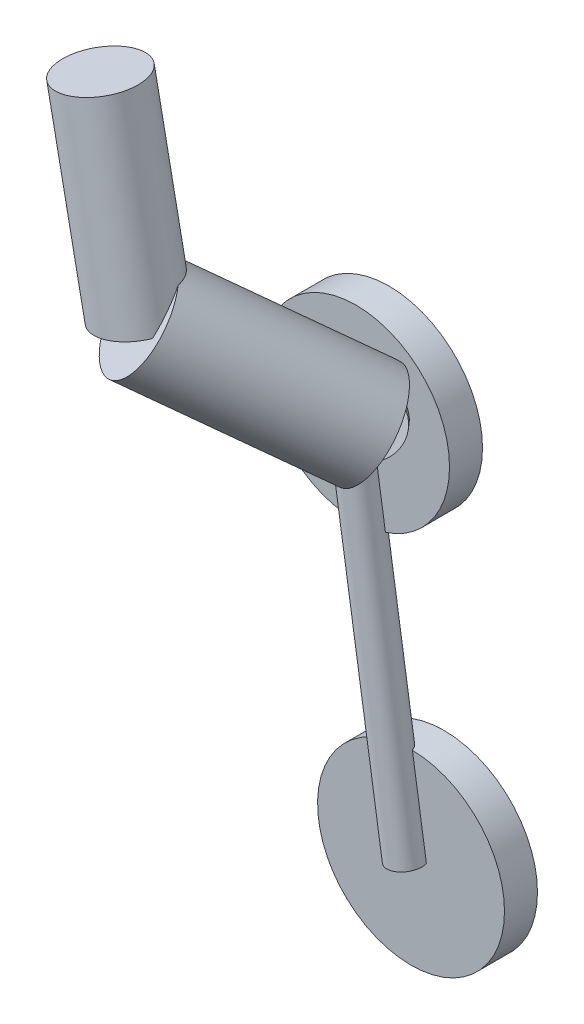
ISO-10303-21;
HEADER;
FILE_DESCRIPTION(('STEP AP214'),'2;1');
FILE_NAME('part.step','',(''),(''),'','','');
FILE_SCHEMA(('AUTOMOTIVE_DESIGN { 1 0 10303 214 1 1 1 1 }'));
ENDSEC;
DATA;
#1=APPLICATION_CONTEXT('core data for automotive mechanical design processes');
#2=APPLICATION_PROTOCOL_DEFINITION('international standard','automotive_design',2000,#1);
#3=PRODUCT_CONTEXT('',#1,'mechanical');
#4=PRODUCT('Part','Part','',(#3));
#5=PRODUCT_RELATED_PRODUCT_CATEGORY('part','',(#4));
#6=PRODUCT_DEFINITION_FORMATION('','',#4);
#7=PRODUCT_DEFINITION_CONTEXT('part definition',#1,'design');
#8=PRODUCT_DEFINITION('design','',#6,#7);
#9=PRODUCT_DEFINITION_SHAPE('','',#8);
#10=(LENGTH_UNIT() NAMED_UNIT(*) SI_UNIT(.MILLI.,.METRE.));
#11=(NAMED_UNIT(*) PLANE_ANGLE_UNIT() SI_UNIT($,.RADIAN.));
#12=(NAMED_UNIT(*) SI_UNIT($,.STERADIAN.) SOLID_ANGLE_UNIT());
#13=UNCERTAINTY_MEASURE_WITH_UNIT(LENGTH_MEASURE(1.E-05),#10,'distance_accuracy_value','');
#14=(GEOMETRIC_REPRESENTATION_CONTEXT(3) GLOBAL_UNCERTAINTY_ASSIGNED_CONTEXT((#13)) GLOBAL_UNIT_ASSIGNED_CONTEXT((#10,
#11,#12)) REPRESENTATION_CONTEXT('',''));
#15=CARTESIAN_POINT('',(0.,0.,0.));
#16=DIRECTION('',(0.,0.,1.));
#17=DIRECTION('',(1.,0.,0.));
#18=AXIS2_PLACEMENT_3D('',#15,#16,#17);
#19=CARTESIAN_POINT('',(-418.1,30.0000000000001,76.));
#20=DIRECTION('',(0.196116135138186,-0.98058067569092,0.));
#21=DIRECTION('',(0.98058067569092,0.196116135138186,0.));
#22=AXIS2_PLACEMENT_3D('',#19,#20,#21);
#23=PLANE('',#22);
#24=CARTESIAN_POINT('',(-418.1,30.0000000000001,76.));
#25=DIRECTION('',(0.196116135138186,-0.98058067569092,0.));
#26=DIRECTION('',(0.98058067569092,0.196116135138186,0.));
#27=AXIS2_PLACEMENT_3D('',#24,#25,#26);
#28=CIRCLE('',#27,6.99999999999998);
#29=CARTESIAN_POINT('',(-412.141803911932,31.1916392176136,79.4756143847064));
#30=VERTEX_POINT('',#29);
#31=CARTESIAN_POINT('',(-424.058196088068,28.8083607823865,72.5243856152937));
#32=VERTEX_POINT('',#31);
#33=EDGE_CURVE('E229',#30,#32,#28,.T.);
#34=ORIENTED_EDGE('',*,*,#33,.T.);
#35=DIRECTION('',(0.851170869723985,0.170234173944798,0.496516340672336));
#36=VECTOR('',#35,1.);
#37=CARTESIAN_POINT('',(-418.1,30.0000000000001,76.));
#38=LINE('',#37,#36);
#39=EDGE_CURVE('E224',#32,#30,#38,.T.);
#40=ORIENTED_EDGE('',*,*,#39,.T.);
#41=EDGE_LOOP('',(#34,#40));
#42=FACE_BOUND('',#41,.T.);
#43=ADVANCED_FACE('F73',(#42),#23,.T.);
#44=CARTESIAN_POINT('',(-425.1,65.0000000000001,76.));
#45=DIRECTION('',(0.196116135138184,-0.98058067569092,0.));
#46=DIRECTION('',(0.98058067569092,0.196116135138184,0.));
#47=AXIS2_PLACEMENT_3D('',#44,#45,#46);
#48=CYLINDRICAL_SURFACE('',#47,6.99999999999998);
#49=CARTESIAN_POINT('',(-425.1,65.0000000000001,76.));
#50=DIRECTION('',(0.196116135138186,-0.98058067569092,0.));
#51=DIRECTION('',(0.98058067569092,0.196116135138186,0.));
#52=AXIS2_PLACEMENT_3D('',#49,#50,#51);
#53=CIRCLE('',#52,6.99999999999998);
#54=CARTESIAN_POINT('',(-418.235935270164,66.3728129459674,76.));
#55=VERTEX_POINT('',#54);
#56=EDGE_CURVE('E226',#55,#55,#53,.T.);
#57=ORIENTED_EDGE('',*,*,#56,.T.);
#58=EDGE_LOOP('',(#57));
#59=FACE_BOUND('',#58,.T.);
#60=ORIENTED_EDGE('',*,*,#33,.F.);
#61=CARTESIAN_POINT('',(-418.1,30.0000000000001,76.));
#62=DIRECTION('',(0.499230176602714,-0.554700196225227,-0.665640235470272));
#63=DIRECTION('',(-0.162102995970275,-0.814449518588493,0.557130685179369));
#64=AXIS2_PLACEMENT_3D('',#61,#62,#63);
#65=ELLIPSE('',#64,10.9062232352501,6.99999999999998);
#66=CARTESIAN_POINT('',(-412.515701600669,36.8857417206084,74.4501056989915));
#67=VERTEX_POINT('',#66);
#68=EDGE_CURVE('E264',#30,#67,#65,.F.);
#69=ORIENTED_EDGE('',*,*,#68,.T.);
#70=CARTESIAN_POINT('',(-421.292691032873,35.1303438341679,69.3301951968721));
#71=CARTESIAN_POINT('',(-421.201196665406,35.1486458103378,69.3004736513031));
#72=CARTESIAN_POINT('',(-421.109263316592,35.1678563071932,69.2727157483057));
#73=CARTESIAN_POINT('',(-420.924630088828,35.2078119264483,69.2211700708622));
#74=CARTESIAN_POINT('',(-420.83193028739,35.2285568953108,69.1973818999837));
#75=CARTESIAN_POINT('',(-420.552920744037,35.2926527992798,69.1320513257817));
#76=CARTESIAN_POINT('',(-420.365602314339,35.3378850043576,69.0965108354709));
#77=CARTESIAN_POINT('',(-419.989501799221,35.4313290540945,69.0417074082911));
#78=CARTESIAN_POINT('',(-419.800720729853,35.4795389686479,69.0224340437146));
#79=CARTESIAN_POINT('',(-419.422529125842,35.5773072190837,69.0002199353194));
#80=CARTESIAN_POINT('',(-419.233118548431,35.6268656483016,68.9972803249208));
#81=CARTESIAN_POINT('',(-418.85482001879,35.7258908863014,69.0077477930543));
#82=CARTESIAN_POINT('',(-418.66593186774,35.7753577265426,69.0211474232981));
#83=CARTESIAN_POINT('',(-418.289688656918,35.8730347151101,69.0641971341939));
#84=CARTESIAN_POINT('',(-418.102333580539,35.9212448770614,69.0938470385839));
#85=CARTESIAN_POINT('',(-417.730349197048,36.0154060142361,69.1692039897324));
#86=CARTESIAN_POINT('',(-417.545719275849,36.0613575040411,69.2149073596023));
#87=CARTESIAN_POINT('',(-417.180335923696,36.1502008522402,69.322075803387));
#88=CARTESIAN_POINT('',(-416.999582498921,36.1930927057571,69.3835409024255));
#89=CARTESIAN_POINT('',(-416.642356795563,36.2753630005016,69.5221339870124));
#90=CARTESIAN_POINT('',(-416.465907950407,36.3147244280699,69.5993325062869));
#91=CARTESIAN_POINT('',(-416.119402838848,36.3892305731797,69.7686696854893));
#92=CARTESIAN_POINT('',(-415.949346607104,36.4243752678619,69.8608084264034));
#93=CARTESIAN_POINT('',(-415.616856513873,36.4901388662376,70.0593591532529));
#94=CARTESIAN_POINT('',(-415.454422856132,36.5207576490035,70.1657715204198));
#95=CARTESIAN_POINT('',(-415.138382979101,36.5773325248755,70.3920846752108));
#96=CARTESIAN_POINT('',(-414.984776665361,36.6032886678762,70.5119853184756));
#97=CARTESIAN_POINT('',(-414.689385686944,36.6502885913913,70.7628250942869));
#98=CARTESIAN_POINT('',(-414.547477890069,36.6713893806518,70.8936086297245));
#99=CARTESIAN_POINT('',(-414.274435583674,36.7093068583583,71.1665461422087));
#100=CARTESIAN_POINT('',(-414.143301069295,36.7261235487362,71.3087001141274));
#101=CARTESIAN_POINT('',(-413.892780253326,36.7558788814993,71.6034028376731));
#102=CARTESIAN_POINT('',(-413.773394878038,36.7688172182787,71.7559524072889));
#103=CARTESIAN_POINT('',(-413.547308343999,36.7914167002375,72.0704059485969));
#104=CARTESIAN_POINT('',(-413.440607075665,36.8010778737302,72.2323098394572));
#105=CARTESIAN_POINT('',(-413.245306975505,36.8175572174245,72.5568533570085));
#106=CARTESIAN_POINT('',(-413.156106029234,36.8244845916663,72.719125518639));
#107=CARTESIAN_POINT('',(-412.990798242488,36.8370166202709,73.0502391056136));
#108=CARTESIAN_POINT('',(-412.914689999754,36.8426214163088,73.219079825072));
#109=CARTESIAN_POINT('',(-412.77624945429,36.8536317742233,73.5624018581627));
#110=CARTESIAN_POINT('',(-412.713921804602,36.8590372682935,73.7368850542617));
#111=CARTESIAN_POINT('',(-412.603756430106,36.8710937335624,74.09038620134));
#112=CARTESIAN_POINT('',(-412.555923799548,36.8777451413094,74.2694057227061));
#113=CARTESIAN_POINT('',(-412.515701600669,36.8857417206084,74.4501056989913));
#114=B_SPLINE_CURVE_WITH_KNOTS('',3,(#70,#71,#72,#73,#74,#75,#76,#77,#78,#79,#80,#81,#82,#83,
#84,#85,#86,#87,#88,#89,#90,#91,#92,#93,#94,#95,#96,#97,#98,#99,#100,#101,#102,#103,#104,#105,
#106,#107,#108,#109,#110,#111,#112,#113),.UNSPECIFIED.,.F.,.F.,(4,2,2,2,2,2,2,2,2,2,2,2,2,2,2,2,
2,2,2,2,2,4),(0.,0.293724164008241,0.587418978041268,1.17449294195843,1.76119028770752,
2.34792834463022,2.93439903533553,3.52086336488549,4.10719345803307,4.69352448577125,
5.28254428878717,5.87156728479613,6.46060601603824,7.04963844364955,7.63135493594895,
8.21307116590418,8.79483322179158,9.37659025134636,9.93192221789129,10.4871946700164,
11.042654325483,11.598308970498),.UNSPECIFIED.);
#115=CARTESIAN_POINT('',(-421.292691032873,35.1303438341679,69.3301951968721));
#116=VERTEX_POINT('',#115);
#117=EDGE_CURVE('E232',#116,#67,#114,.T.);
#118=ORIENTED_EDGE('',*,*,#117,.F.);
#119=EDGE_CURVE('E241',#116,#32,#65,.F.);
#120=ORIENTED_EDGE('',*,*,#119,.T.);
#121=EDGE_LOOP('',(#60,#69,#118,#120));
#122=FACE_BOUND('',#121,.T.);
#123=ADVANCED_FACE('F243',(#59,#122),#48,.T.);
#124=CARTESIAN_POINT('',(-425.1,65.0000000000001,76.));
#125=DIRECTION('',(0.196116135138186,-0.98058067569092,0.));
#126=DIRECTION('',(0.98058067569092,0.196116135138186,0.));
#127=AXIS2_PLACEMENT_3D('',#124,#125,#126);
#128=PLANE('',#127);
#129=ORIENTED_EDGE('',*,*,#56,.F.);
#130=EDGE_LOOP('',(#129));
#131=FACE_BOUND('',#130,.T.);
#132=ADVANCED_FACE('F75',(#131),#128,.F.);
#133=CARTESIAN_POINT('',(-418.1,30.,76.));
#134=DIRECTION('',(0.499230176602714,-0.554700196225227,-0.665640235470272));
#135=DIRECTION('',(0.,0.768221279597376,-0.64018439966448));
#136=AXIS2_PLACEMENT_3D('',#133,#134,#135);
#137=PLANE('',#136);
#138=ORIENTED_EDGE('',*,*,#68,.F.);
#139=ORIENTED_EDGE('',*,*,#39,.F.);
#140=ORIENTED_EDGE('',*,*,#119,.F.);
#141=CARTESIAN_POINT('',(-418.1,30.,76.));
#142=DIRECTION('',(0.499230176602714,-0.554700196225227,-0.665640235470272));
#143=DIRECTION('',(0.,0.768221279597376,-0.64018439966448));
#144=AXIS2_PLACEMENT_3D('',#141,#142,#143);
#145=CIRCLE('',#144,8.99999999999998);
#146=EDGE_CURVE('E219',#67,#116,#145,.T.);
#147=ORIENTED_EDGE('',*,*,#146,.F.);
#148=EDGE_LOOP('',(#138,#139,#140,#147));
#149=FACE_BOUND('',#148,.T.);
#150=ADVANCED_FACE('F274',(#149),#137,.F.);
#151=CARTESIAN_POINT('',(-400.1,9.99999999999996,52.));
#152=DIRECTION('',(0.499230176602714,-0.554700196225227,-0.665640235470272));
#153=DIRECTION('',(0.,0.768221279597376,-0.64018439966448));
#154=AXIS2_PLACEMENT_3D('',#151,#152,#153);
#155=PLANE('',#154);
#156=DIRECTION('',(-0.74329414624716,-0.668964731622457,0.));
#157=VECTOR('',#156,1.);
#158=CARTESIAN_POINT('',(-403.381767955801,13.6464088397789,46.5));
#159=LINE('',#158,#157);
#160=CARTESIAN_POINT('',(-399.542187691458,17.1020310776875,46.5));
#161=VERTEX_POINT('',#160);
#162=CARTESIAN_POINT('',(-404.859442177721,12.3165020400508,46.5));
#163=VERTEX_POINT('',#162);
#164=EDGE_CURVE('E188',#161,#163,#159,.T.);
#165=ORIENTED_EDGE('',*,*,#164,.F.);
#166=CARTESIAN_POINT('',(-400.1,9.99999999999996,52.));
#167=DIRECTION('',(0.499230176602714,-0.554700196225227,-0.665640235470272));
#168=DIRECTION('',(0.,0.768221279597376,-0.64018439966448));
#169=AXIS2_PLACEMENT_3D('',#166,#167,#168);
#170=CIRCLE('',#169,8.99999999999998);
#171=CARTESIAN_POINT('',(-407.441014054616,4.95963285305732,50.6945454148237));
#172=VERTEX_POINT('',#171);
#173=EDGE_CURVE('E222',#161,#172,#170,.T.);
#174=ORIENTED_EDGE('',*,*,#173,.T.);
#175=CARTESIAN_POINT('',(-400.1,9.99999999999989,51.9999999999998));
#176=DIRECTION('',(0.499230176602714,-0.554700196225227,-0.665640235470272));
#177=DIRECTION('',(-0.858594269751768,-0.213355503778683,-0.466149449164936));
#178=AXIS2_PLACEMENT_3D('',#175,#176,#177);
#179=ELLIPSE('',#178,14.3077571290021,5.);
#180=CARTESIAN_POINT('',(-400.68277591574,5.9788461813957,54.9138795786988));
#181=VERTEX_POINT('',#180);
#182=EDGE_CURVE('E215',#181,#172,#179,.T.);
#183=ORIENTED_EDGE('',*,*,#182,.F.);
#184=DIRECTION('',(0.116555183147948,0.80423076372086,-0.582775915739755));
#185=VECTOR('',#184,1.);
#186=CARTESIAN_POINT('',(-400.1,9.99999999999996,52.));
#187=LINE('',#186,#185);
#188=CARTESIAN_POINT('',(-399.51722408426,14.0211538186043,49.0861204213013));
#189=VERTEX_POINT('',#188);
#190=EDGE_CURVE('E263',#181,#189,#187,.T.);
#191=ORIENTED_EDGE('',*,*,#190,.T.);
#192=EDGE_CURVE('E218',#163,#189,#179,.T.);
#193=ORIENTED_EDGE('',*,*,#192,.F.);
#194=EDGE_LOOP('',(#165,#174,#183,#191,#193));
#195=FACE_BOUND('',#194,.T.);
#196=ADVANCED_FACE('F252',(#195),#155,.T.);
#197=CARTESIAN_POINT('',(-418.1,30.,76.));
#198=DIRECTION('',(0.499230176602707,-0.554700196225229,-0.665640235470275));
#199=DIRECTION('',(0.,0.768221279597376,-0.64018439966448));
#200=AXIS2_PLACEMENT_3D('',#197,#198,#199);
#201=CYLINDRICAL_SURFACE('',#200,8.99999999999998);
#202=CARTESIAN_POINT('',(-395.975,5.41666666666666,46.5));
#203=DIRECTION('',(0.,0.,1.));
#204=DIRECTION('',(0.66896473162245,-0.743294146247166,0.));
#205=AXIS2_PLACEMENT_3D('',#202,#203,#204);
#206=ELLIPSE('',#205,13.5208172829899,8.99999999999998);
#207=CARTESIAN_POINT('',(-407.100218921467,11.4733196836291,46.5));
#208=VERTEX_POINT('',#207);
#209=EDGE_CURVE('E192',#208,#161,#206,.F.);
#210=ORIENTED_EDGE('',*,*,#209,.F.);
#211=CARTESIAN_POINT('',(-408.541487813923,6.99969509346329,50.3263051539125));
#212=CARTESIAN_POINT('',(-408.585917175554,7.12276459772534,50.2791057426722));
#213=CARTESIAN_POINT('',(-408.625988994717,7.24589328408239,50.2281093527698));
#214=CARTESIAN_POINT('',(-408.696859546481,7.4917925725616,50.1191779050424));
#215=CARTESIAN_POINT('',(-408.727657675508,7.61456315086173,50.0612423959313));
#216=CARTESIAN_POINT('',(-408.779452338289,7.85908716724929,49.9391125689465));
#217=CARTESIAN_POINT('',(-408.800446505793,7.98084035282566,49.8749167446198));
#218=CARTESIAN_POINT('',(-408.832233644752,8.22259616318035,49.740946249167));
#219=CARTESIAN_POINT('',(-408.843026931852,8.34259884201154,49.6711717507346));
#220=CARTESIAN_POINT('',(-408.854157858289,8.58020940659863,49.5266311910404));
#221=CARTESIAN_POINT('',(-408.854485854976,8.69781498399941,49.4518605899511));
#222=CARTESIAN_POINT('',(-408.844547328834,8.92968328504842,49.2980508042381));
#223=CARTESIAN_POINT('',(-408.834284510162,9.04394716309333,49.219013121194));
#224=CARTESIAN_POINT('',(-408.803202340991,9.26836803314808,49.0572523876805));
#225=CARTESIAN_POINT('',(-408.782382278725,9.37852474771626,48.9745290890709));
#226=CARTESIAN_POINT('',(-408.730369987648,9.59390025986719,48.8059812877491));
#227=CARTESIAN_POINT('',(-408.699178082234,9.69911921129446,48.7201568818049));
#228=CARTESIAN_POINT('',(-408.627202386712,9.90254016438266,48.5470165784424));
#229=CARTESIAN_POINT('',(-408.586542418411,10.0008130344725,48.4597324020476));
#230=CARTESIAN_POINT('',(-408.495877781066,10.1909924326327,48.2831088017928));
#231=CARTESIAN_POINT('',(-408.445873123907,10.2828989688,48.193769380547));
#232=CARTESIAN_POINT('',(-408.33707020945,10.4596340229488,48.01339957257));
#233=CARTESIAN_POINT('',(-408.27826930003,10.5444603941607,47.9223686831258));
#234=CARTESIAN_POINT('',(-408.152581359525,10.7062633316939,47.7389961688057));
#235=CARTESIAN_POINT('',(-408.085697063624,10.7832425371077,47.6466549965743));
#236=CARTESIAN_POINT('',(-407.943451756579,10.9298737513515,47.4593766306779));
#237=CARTESIAN_POINT('',(-407.867970959464,10.9993868318038,47.364421616506));
#238=CARTESIAN_POINT('',(-407.710368154138,11.1288993716363,47.1736136855695));
#239=CARTESIAN_POINT('',(-407.62824854344,11.1889022425216,47.0777611039079));
#240=CARTESIAN_POINT('',(-407.45827506955,11.2987745923673,46.8851808076528));
#241=CARTESIAN_POINT('',(-407.370416980695,11.348636490063,46.7884524943874));
#242=CARTESIAN_POINT('',(-407.190152084894,11.437471248399,46.594312919135));
#243=CARTESIAN_POINT('',(-407.097747152209,11.476448552292,46.4969019525128));
#244=CARTESIAN_POINT('',(-406.908625160823,11.543207066794,46.3004526895746));
#245=CARTESIAN_POINT('',(-406.811874659625,11.5708745335747,46.2014078073995));
#246=CARTESIAN_POINT('',(-406.616310648649,11.6138117362036,46.0027495677465));
#247=CARTESIAN_POINT('',(-406.517498138212,11.6290873408517,45.903136501898));
#248=CARTESIAN_POINT('',(-406.319282113212,11.646709297369,45.7034674052369));
#249=CARTESIAN_POINT('',(-406.219879017241,11.6490639154467,45.6034116986237));
#250=CARTESIAN_POINT('',(-406.021961095538,11.640470742779,45.4029922797805));
#251=CARTESIAN_POINT('',(-405.923446175158,11.6295243867175,45.302628601934));
#252=CARTESIAN_POINT('',(-405.736172306099,11.5955013137602,45.1094400947866));
#253=CARTESIAN_POINT('',(-405.647236288715,11.5733972688661,45.0166151196605));
#254=CARTESIAN_POINT('',(-405.472640862317,11.5177823778662,44.8313062385366));
#255=CARTESIAN_POINT('',(-405.386981248049,11.484272247613,44.7388223115024));
#256=CARTESIAN_POINT('',(-405.220024941714,11.4062020242839,44.5546489770421));
#257=CARTESIAN_POINT('',(-405.138726579403,11.3616461987037,44.4629592768929));
#258=CARTESIAN_POINT('',(-404.981322441919,11.2620887501886,44.2808501586528));
#259=CARTESIAN_POINT('',(-404.905216618712,11.207087223904,44.1904307288169));
#260=CARTESIAN_POINT('',(-404.695674561075,11.0357231594364,43.9340899326184));
#261=CARTESIAN_POINT('',(-404.569347685477,10.9073261098235,43.7702477906897));
#262=CARTESIAN_POINT('',(-404.338435530166,10.6227268098557,43.4517766242493));
#263=CARTESIAN_POINT('',(-404.233867111688,10.4665031686066,43.2971548105292));
#264=CARTESIAN_POINT('',(-404.073066655382,10.1810582662978,43.0433369236682));
#265=CARTESIAN_POINT('',(-404.011643269804,10.0573075355046,42.9411592168776));
#266=CARTESIAN_POINT('',(-403.898377228179,9.8004010924662,42.7434363453809));
#267=CARTESIAN_POINT('',(-403.846538133614,9.66724190938331,42.6478936544197));
#268=CARTESIAN_POINT('',(-403.751539170975,9.39271859586731,42.4640441335867));
#269=CARTESIAN_POINT('',(-403.708395375782,9.25133988214113,42.375750879238));
#270=CARTESIAN_POINT('',(-403.630043358795,8.96172856707453,42.2073203844602));
#271=CARTESIAN_POINT('',(-403.594834347269,8.81349664959024,42.1271823327969));
#272=CARTESIAN_POINT('',(-403.530969155372,8.50828555912344,41.9744411634904));
#273=CARTESIAN_POINT('',(-403.50244576671,8.35119549674325,41.9020042199602));
#274=CARTESIAN_POINT('',(-403.452064415033,8.03164307736719,41.76733786392));
#275=CARTESIAN_POINT('',(-403.430207129332,7.86918017631876,41.7051094889539));
#276=CARTESIAN_POINT('',(-403.392561456353,7.53982325400917,41.592045168709));
#277=CARTESIAN_POINT('',(-403.376766644897,7.37293412473306,41.5411971880109));
#278=CARTESIAN_POINT('',(-403.350711109391,7.03545231605635,41.4521514475389));
#279=CARTESIAN_POINT('',(-403.34044896795,6.86486059686787,41.4139504487558));
#280=CARTESIAN_POINT('',(-403.320663438181,6.4231689300831,41.334041404746));
#281=CARTESIAN_POINT('',(-403.31485634426,6.14991108127416,41.3026204542075));
#282=CARTESIAN_POINT('',(-403.314603088784,5.60186324463875,41.2815998241318));
#283=CARTESIAN_POINT('',(-403.320139931951,5.32707616299965,41.2919376049807));
#284=CARTESIAN_POINT('',(-403.339515209343,4.83641911249764,41.3549873382621));
#285=CARTESIAN_POINT('',(-403.351541040965,4.61943248590754,41.3991175571431));
#286=CARTESIAN_POINT('',(-403.3742032208,4.30197818656113,41.4912970173334));
#287=CARTESIAN_POINT('',(-403.38252967566,4.19748047851093,41.526362427645));
#288=CARTESIAN_POINT('',(-403.400641524358,3.99201252451537,41.6052934556679));
#289=CARTESIAN_POINT('',(-403.410426297201,3.89104079957986,41.6491553303117));
#290=CARTESIAN_POINT('',(-403.431421773192,3.69296380965296,41.7459295012071));
#291=CARTESIAN_POINT('',(-403.442640268657,3.59588379696862,41.7988918454297));
#292=CARTESIAN_POINT('',(-403.466353823857,3.40710863574118,41.9134371125733));
#293=CARTESIAN_POINT('',(-403.478848882815,3.31541348391377,41.9750200302365));
#294=CARTESIAN_POINT('',(-403.505003551228,3.13823593543701,42.1063247836041));
#295=CARTESIAN_POINT('',(-403.518663097099,3.05275320004296,42.1760461750006));
#296=CARTESIAN_POINT('',(-403.547037488088,2.88866652500333,42.322956865879));
#297=CARTESIAN_POINT('',(-403.561752296958,2.81006234929111,42.4001459088857));
#298=CARTESIAN_POINT('',(-403.590874073433,2.66644270676659,42.5544821105472));
#299=CARTESIAN_POINT('',(-403.605204982047,2.60084082168957,42.6310995576391));
#300=CARTESIAN_POINT('',(-403.634608623465,2.47602386957855,42.7892532168902));
#301=CARTESIAN_POINT('',(-403.649681589893,2.41681083294383,42.8707909799817));
#302=CARTESIAN_POINT('',(-403.695931613988,2.24894784686326,43.1217063631075));
#303=CARTESIAN_POINT('',(-403.728154357344,2.15000246599217,43.2974640928115));
#304=CARTESIAN_POINT('',(-403.808037403495,1.94450933265311,43.7302270424696));
#305=CARTESIAN_POINT('',(-403.856873509334,1.84963811004627,43.9925102478607));
#306=CARTESIAN_POINT('',(-403.959926669801,1.70402541335002,44.5282170874351));
#307=CARTESIAN_POINT('',(-404.01415492649,1.65337804068357,44.8016631875356));
#308=CARTESIAN_POINT('',(-404.109326539899,1.6019183255868,45.2564650909487));
#309=CARTESIAN_POINT('',(-404.148407094441,1.58994640959697,45.4370788399824));
#310=CARTESIAN_POINT('',(-404.229941238103,1.58151761031247,45.7979780467017));
#311=CARTESIAN_POINT('',(-404.272395874587,1.58506556322172,45.9782633845392));
#312=CARTESIAN_POINT('',(-404.361358511186,1.60666414750738,46.337230364933));
#313=CARTESIAN_POINT('',(-404.407872747308,1.62473745384784,46.5159090580973));
#314=CARTESIAN_POINT('',(-404.505637862954,1.67461732750431,46.8700054026586));
#315=CARTESIAN_POINT('',(-404.556888276271,1.7064225442452,47.0454233729883));
#316=CARTESIAN_POINT('',(-404.665713967137,1.78374415125479,47.3940022569751));
#317=CARTESIAN_POINT('',(-404.723366943467,1.82944415828194,47.5670983622109));
#318=CARTESIAN_POINT('',(-404.845355349672,1.93404623647155,47.9068911420102));
#319=CARTESIAN_POINT('',(-404.909691855988,1.99295043606014,48.0735867797822));
#320=CARTESIAN_POINT('',(-405.045787894338,2.12359273105348,48.3981581818795));
#321=CARTESIAN_POINT('',(-405.117527205221,2.19529623649516,48.5560562487246));
#322=CARTESIAN_POINT('',(-405.269339176378,2.35151693434683,48.861121906676));
#323=CARTESIAN_POINT('',(-405.349407196364,2.43602700352163,49.0082953960066));
#324=CARTESIAN_POINT('',(-405.491656029146,2.58904288611967,49.2449174009192));
#325=CARTESIAN_POINT('',(-405.551521999901,2.65419930945286,49.3379410877241));
#326=CARTESIAN_POINT('',(-405.67531167051,2.79032825895076,49.5167353681059));
#327=CARTESIAN_POINT('',(-405.739234238387,2.86129916420197,49.6025079696246));
#328=CARTESIAN_POINT('',(-405.870892648594,3.00884432988359,49.7658076567399));
#329=CARTESIAN_POINT('',(-405.93862608804,3.0854150683625,49.8433398510286));
#330=CARTESIAN_POINT('',(-406.077484511116,3.24390160839992,49.9892921226799));
#331=CARTESIAN_POINT('',(-406.148607959755,3.32581499688884,50.0577162719101));
#332=CARTESIAN_POINT('',(-406.293947083217,3.49503839819173,50.185015777592));
#333=CARTESIAN_POINT('',(-406.36817502686,3.58237064610813,50.2438476300439));
#334=CARTESIAN_POINT('',(-406.51857096736,3.76167063462321,50.3510405434733));
#335=CARTESIAN_POINT('',(-406.594738976219,3.85363840389994,50.3994015396621));
#336=CARTESIAN_POINT('',(-406.748046563532,4.04177424654514,50.4853762746123));
#337=CARTESIAN_POINT('',(-406.825186593898,4.13794432909603,50.5229848062027));
#338=CARTESIAN_POINT('',(-406.979313183253,4.33394665459742,50.5873894337155));
#339=CARTESIAN_POINT('',(-407.056299744537,4.43377884230397,50.6141856926712));
#340=CARTESIAN_POINT('',(-407.20476329545,4.63097924513445,50.6559664335658));
#341=CARTESIAN_POINT('',(-407.276308341615,4.7281750413191,50.6715256289057));
#342=CARTESIAN_POINT('',(-407.417391828108,4.92504049006642,50.6935035422347));
#343=CARTESIAN_POINT('',(-407.486929553376,5.02471100123328,50.6999190414198));
#344=CARTESIAN_POINT('',(-407.691167027107,5.3268232496162,50.7060258318751));
#345=CARTESIAN_POINT('',(-407.821634761382,5.53255340018979,50.6926154768623));
#346=CARTESIAN_POINT('',(-408.063199600199,5.94682454987673,50.6351067294551));
#347=CARTESIAN_POINT('',(-408.174542806593,6.15528560940806,50.5914415562376));
#348=CARTESIAN_POINT('',(-408.375404387847,6.57567032793433,50.477716162279));
#349=CARTESIAN_POINT('',(-408.464917425514,6.7875948202074,50.4076494973518));
#350=CARTESIAN_POINT('',(-408.541487813923,6.99969509346329,50.3263051539125));
#351=B_SPLINE_CURVE_WITH_KNOTS('',3,(#211,#212,#213,#214,#215,#216,#217,#218,#219,#220,#221,
#222,#223,#224,#225,#226,#227,#228,#229,#230,#231,#232,#233,#234,#235,#236,#237,#238,#239,#240,
#241,#242,#243,#244,#245,#246,#247,#248,#249,#250,#251,#252,#253,#254,#255,#256,#257,#258,#259,
#260,#261,#262,#263,#264,#265,#266,#267,#268,#269,#270,#271,#272,#273,#274,#275,#276,#277,#278,
#279,#280,#281,#282,#283,#284,#285,#286,#287,#288,#289,#290,#291,#292,#293,#294,#295,#296,#297,
#298,#299,#300,#301,#302,#303,#304,#305,#306,#307,#308,#309,#310,#311,#312,#313,#314,#315,#316,
#317,#318,#319,#320,#321,#322,#323,#324,#325,#326,#327,#328,#329,#330,#331,#332,#333,#334,#335,
#336,#337,#338,#339,#340,#341,#342,#343,#344,#345,#346,#347,#348,#349,#350),.UNSPECIFIED.,.T.,
.F.,(4,2,2,2,2,2,2,2,2,2,2,2,2,2,2,2,2,2,2,2,2,2,2,2,2,2,2,2,2,2,2,2,2,2,2,2,2,2,2,2,2,2,2,2,2,
2,2,2,2,2,2,2,2,2,2,2,2,2,2,2,2,2,2,2,2,2,2,2,2,4),(0.,0.417081104893405,0.834189349432856,
1.25139821379855,1.66859416803391,2.08617451277035,2.50360885748476,2.92107134927076,
3.33852082564719,3.75079045017535,4.16305955035883,4.57545320353965,4.98770770320112,
5.40664179066606,5.82542525617545,6.24452065737994,6.66344472669963,7.08648401435956,
7.50932283297529,7.93189110865351,8.35441380887013,8.74520676147169,9.13597519220316,
9.52659288450541,9.91720696273783,10.644415064875,11.3721846191299,11.8870497357785,
12.402105791244,12.9181053454138,13.4340535205423,13.9595148110769,14.4850294736209,
15.0099857202336,15.5348074164976,16.3571290408136,17.1782195789933,17.8405129961155,
18.1717732299488,18.5028928040277,18.8358953313188,19.1688976555036,19.5018818084106,
19.8348545290838,20.1401531879068,20.4455485877308,21.0560223501505,21.9009693636255,
22.7477099409987,23.3026208799924,23.8577047491583,24.4136568251724,24.9695542340609,
25.533142935081,26.0968225481811,26.6590012721724,27.2208684425129,27.6056687296215,
27.9903621079131,28.3748155846379,28.759096605116,29.1450746933865,29.5310551698381,
29.9172222523518,30.3033835118143,30.6680385400975,31.0328219041623,31.7616781908137,
32.4803080065483,33.1991133421853),.UNSPECIFIED.);
#352=EDGE_CURVE('E256',#172,#208,#351,.T.);
#353=ORIENTED_EDGE('',*,*,#352,.F.);
#354=ORIENTED_EDGE('',*,*,#173,.F.);
#355=EDGE_LOOP('',(#210,#353,#354));
#356=FACE_BOUND('',#355,.T.);
#357=ORIENTED_EDGE('',*,*,#146,.T.);
#358=ORIENTED_EDGE('',*,*,#117,.T.);
#359=EDGE_LOOP('',(#357,#358));
#360=FACE_BOUND('',#359,.T.);
#361=ADVANCED_FACE('F246',(#356,#360),#201,.T.);
#362=CARTESIAN_POINT('',(-400.1,10.0000000000001,52.0000000000001));
#363=DIRECTION('',(-0.629999384766533,-0.393749615479077,-0.669374346314429));
#364=DIRECTION('',(-0.728199992692797,0.,0.685364699004997));
#365=AXIS2_PLACEMENT_3D('',#362,#363,#364);
#366=PLANE('',#365);
#367=ORIENTED_EDGE('',*,*,#190,.F.);
#368=CARTESIAN_POINT('',(-400.1,10.0000000000001,52.0000000000001));
#369=DIRECTION('',(-0.629999384766533,-0.393749615479077,-0.669374346314429));
#370=DIRECTION('',(-0.728199992692797,0.,0.685364699004997));
#371=AXIS2_PLACEMENT_3D('',#368,#369,#370);
#372=CIRCLE('',#371,5.);
#373=EDGE_CURVE('E208',#189,#181,#372,.T.);
#374=ORIENTED_EDGE('',*,*,#373,.F.);
#375=EDGE_LOOP('',(#367,#374));
#376=FACE_BOUND('',#375,.T.);
#377=ADVANCED_FACE('F251',(#376),#366,.F.);
#378=CARTESIAN_POINT('',(-408.1,5.00000000000004,43.5000000000001));
#379=DIRECTION('',(-0.629999384766533,-0.393749615479077,-0.669374346314429));
#380=DIRECTION('',(-0.728199992692797,0.,0.685364699004997));
#381=AXIS2_PLACEMENT_3D('',#378,#379,#380);
#382=PLANE('',#381);
#383=DIRECTION('',(-0.529998940003174,0.847998304005091,0.));
#384=VECTOR('',#383,1.);
#385=CARTESIAN_POINT('',(-410.392134831461,3.5674157303372,46.5));
#386=LINE('',#385,#384);
#387=CARTESIAN_POINT('',(-410.855321477089,4.30851436334302,46.5));
#388=VERTEX_POINT('',#387);
#389=CARTESIAN_POINT('',(-411.954851802888,6.06776288462073,46.5));
#390=VERTEX_POINT('',#389);
#391=EDGE_CURVE('E195',#388,#390,#386,.T.);
#392=ORIENTED_EDGE('',*,*,#391,.F.);
#393=CARTESIAN_POINT('',(-406.712244897959,-4.02040816326542,47.5));
#394=DIRECTION('',(-0.629999384766533,-0.393749615479077,-0.669374346314429));
#395=DIRECTION('',(0.352389317088747,-0.913031103233792,0.205416585818699));
#396=AXIS2_PLACEMENT_3D('',#393,#394,#395);
#397=ELLIPSE('',#396,10.2258186842635,2.99999999999998);
#398=CARTESIAN_POINT('',(-410.820172220157,3.04338887799144,47.2111098083885));
#399=VERTEX_POINT('',#398);
#400=EDGE_CURVE('E205',#399,#388,#397,.T.);
#401=ORIENTED_EDGE('',*,*,#400,.F.);
#402=CARTESIAN_POINT('',(-408.1,5.00000000000004,43.5000000000001));
#403=DIRECTION('',(-0.629999384766533,-0.393749615479077,-0.669374346314429));
#404=DIRECTION('',(-0.728199992692797,0.,0.685364699004997));
#405=AXIS2_PLACEMENT_3D('',#402,#403,#404);
#406=CIRCLE('',#405,5.);
#407=EDGE_CURVE('E212',#399,#390,#406,.T.);
#408=ORIENTED_EDGE('',*,*,#407,.T.);
#409=EDGE_LOOP('',(#392,#401,#408));
#410=FACE_BOUND('',#409,.T.);
#411=ADVANCED_FACE('F271',(#410),#382,.T.);
#412=CARTESIAN_POINT('',(-400.1,10.0000000000001,52.0000000000001));
#413=DIRECTION('',(-0.629999384766526,-0.393749615479079,-0.669374346314434));
#414=DIRECTION('',(-0.728199992692803,0.,0.685364699004991));
#415=AXIS2_PLACEMENT_3D('',#412,#413,#414);
#416=CYLINDRICAL_SURFACE('',#415,5.);
#417=CARTESIAN_POINT('',(-405.276470588235,6.76470588235295,46.5));
#418=DIRECTION('',(0.,0.,1.));
#419=DIRECTION('',(-0.847998304005088,-0.52999894000318,0.));
#420=AXIS2_PLACEMENT_3D('',#417,#418,#419);
#421=ELLIPSE('',#420,7.469661823059,5.);
#422=EDGE_CURVE('E189',#390,#208,#421,.F.);
#423=ORIENTED_EDGE('',*,*,#422,.F.);
#424=ORIENTED_EDGE('',*,*,#407,.F.);
#425=CARTESIAN_POINT('',(-411.064604105573,4.54390706068114,47.5556931586926));
#426=CARTESIAN_POINT('',(-411.045352270321,4.4182041052505,47.5486938028301));
#427=CARTESIAN_POINT('',(-411.026349955464,4.29293650752736,47.5355745180744));
#428=CARTESIAN_POINT('',(-410.98832415657,4.04424616278804,47.4986014860475));
#429=CARTESIAN_POINT('',(-410.96930079457,3.92082017669275,47.4747696665866));
#430=CARTESIAN_POINT('',(-410.930610800602,3.67609205486321,47.4177952407304));
#431=CARTESIAN_POINT('',(-410.910943277353,3.55479325203976,47.3846392067992));
#432=CARTESIAN_POINT('',(-410.870203091556,3.31482821068335,47.3103756160343));
#433=CARTESIAN_POINT('',(-410.849129480971,3.19616382170362,47.2692626581111));
#434=CARTESIAN_POINT('',(-410.795280708155,2.91164076085351,47.1611897102968));
#435=CARTESIAN_POINT('',(-410.761359109385,2.7473330438626,47.0907006088107));
#436=CARTESIAN_POINT('',(-410.686613716989,2.42557507739236,46.9385017393766));
#437=CARTESIAN_POINT('',(-410.645787215425,2.26812754889857,46.8567875715971));
#438=CARTESIAN_POINT('',(-410.554808562497,1.96128583954842,46.6842098788067));
#439=CARTESIAN_POINT('',(-410.504664460718,1.81188484981469,46.5933542820182));
#440=CARTESIAN_POINT('',(-410.392433446063,1.52268547983152,46.40424558031));
#441=CARTESIAN_POINT('',(-410.330357954154,1.38287808868218,46.3059996039131));
#442=CARTESIAN_POINT('',(-410.189549396575,1.11169868242963,46.1013433694879));
#443=CARTESIAN_POINT('',(-410.110435891169,0.980628124283747,45.9947897404858));
#444=CARTESIAN_POINT('',(-409.933149024538,0.734917533544623,45.7786714814435));
#445=CARTESIAN_POINT('',(-409.835007657145,0.620250474498719,45.6691121670526));
#446=CARTESIAN_POINT('',(-409.636151857222,0.431489633786467,45.4710998951145));
#447=CARTESIAN_POINT('',(-409.53911816292,0.353808691625175,45.3824158642799));
#448=CARTESIAN_POINT('',(-409.328975963696,0.216894672384365,45.2098533396429));
#449=CARTESIAN_POINT('',(-409.215888692983,0.15763755108576,45.1259687000643));
#450=CARTESIAN_POINT('',(-408.994565272878,0.069310737750132,44.9814002220796));
#451=CARTESIAN_POINT('',(-408.888696477783,0.0368449627889164,44.9191847961436));
#452=CARTESIAN_POINT('',(-408.667989526449,-0.0114084678931598,44.8050174680734));
#453=CARTESIAN_POINT('',(-408.553156570386,-0.0272057170543212,44.7530596762518));
#454=CARTESIAN_POINT('',(-408.317183663117,-0.0421097169259932,44.6623303380473));
#455=CARTESIAN_POINT('',(-408.196035455967,-0.0411940439745791,44.6235765784425));
#456=CARTESIAN_POINT('',(-407.950918891475,-0.0241338068815537,44.5613318824784));
#457=CARTESIAN_POINT('',(-407.826949226142,-0.00798203312082865,44.5378481806939));
#458=CARTESIAN_POINT('',(-407.580461702799,0.036745518846734,44.507072671805));
#459=CARTESIAN_POINT('',(-407.457940610229,0.065211754029821,44.4996414849284));
#460=CARTESIAN_POINT('',(-407.215593750023,0.131625656944048,44.5003857368815));
#461=CARTESIAN_POINT('',(-407.095768863964,0.169576378083213,44.5085662073224));
#462=CARTESIAN_POINT('',(-406.843661504961,0.258081433405828,44.5421585358321));
#463=CARTESIAN_POINT('',(-406.712048432442,0.309662072945559,44.5698675659492));
#464=CARTESIAN_POINT('',(-406.456314420641,0.41797533061031,44.6436688719612));
#465=CARTESIAN_POINT('',(-406.332198543843,0.474711366584681,44.6897734131328));
#466=CARTESIAN_POINT('',(-406.07236938736,0.600334971547276,44.8085550487266));
#467=CARTESIAN_POINT('',(-405.938312223404,0.669639080762625,44.8844313995657));
#468=CARTESIAN_POINT('',(-405.684671099658,0.807703390229138,45.0578117745481));
#469=CARTESIAN_POINT('',(-405.565093128866,0.876463354490543,45.1553247012683));
#470=CARTESIAN_POINT('',(-405.33318924329,1.01679550760012,45.3791294906777));
#471=CARTESIAN_POINT('',(-405.222389976917,1.08809496748391,45.5071830861263));
#472=CARTESIAN_POINT('',(-405.024170215603,1.22541992593927,45.782728446158));
#473=CARTESIAN_POINT('',(-404.936749798285,1.29144540699937,45.9302202752788));
#474=CARTESIAN_POINT('',(-404.788255874623,1.41847982667994,46.2407731565891));
#475=CARTESIAN_POINT('',(-404.727294218685,1.47946660286248,46.4038968132016));
#476=CARTESIAN_POINT('',(-404.63495615349,1.59764492253845,46.7396151947463));
#477=CARTESIAN_POINT('',(-404.603579740231,1.65483646654511,46.9122099183978));
#478=CARTESIAN_POINT('',(-404.571996636073,1.76794727423092,47.2600421482978));
#479=CARTESIAN_POINT('',(-404.57169375332,1.82386992843417,47.4352698191949));
#480=CARTESIAN_POINT('',(-404.6019703969,1.93783432679182,47.782304880849));
#481=CARTESIAN_POINT('',(-404.632545027922,1.99587573363395,47.9541128093681));
#482=CARTESIAN_POINT('',(-404.722727298669,2.11725659107532,48.2881285385624));
#483=CARTESIAN_POINT('',(-404.782360690941,2.18060069973481,48.4503276804368));
#484=CARTESIAN_POINT('',(-404.926942938369,2.31504128589325,48.7594687944327));
#485=CARTESIAN_POINT('',(-405.011893266953,2.38613821444798,48.9064098778748));
#486=CARTESIAN_POINT('',(-405.203989000521,2.53931132237043,49.1839753918612));
#487=CARTESIAN_POINT('',(-405.311566452868,2.62158817602703,49.3141882418098));
#488=CARTESIAN_POINT('',(-405.54156855041,2.79674462096993,49.5523505029497));
#489=CARTESIAN_POINT('',(-405.663996611212,2.88962665113427,49.6602947769405));
#490=CARTESIAN_POINT('',(-405.930320228114,3.09613522285552,49.8633052571738));
#491=CARTESIAN_POINT('',(-406.075136415477,3.21090865143779,49.9559836838806));
#492=CARTESIAN_POINT('',(-406.367932322981,3.45372506964817,50.1156100682891));
#493=CARTESIAN_POINT('',(-406.515915865911,3.58178490614694,50.1825248393243));
#494=CARTESIAN_POINT('',(-406.836314095066,3.87720031208788,50.3041997512958));
#495=CARTESIAN_POINT('',(-407.007947741888,4.04737479460046,50.3541401434043));
#496=CARTESIAN_POINT('',(-407.334680223634,4.407618957289,50.4283590163739));
#497=CARTESIAN_POINT('',(-407.489809684769,4.59765044251501,50.4526858014323));
#498=CARTESIAN_POINT('',(-407.659199497171,4.83872894008228,50.4717771660362));
#499=CARTESIAN_POINT('',(-407.687160962642,4.87978767226468,50.4746474639391));
#500=CARTESIAN_POINT('',(-407.741797725038,4.96275144100561,50.4797761553233));
#501=CARTESIAN_POINT('',(-407.768473834405,5.0046559185739,50.4820349396117));
#502=CARTESIAN_POINT('',(-407.794469246605,5.04700473129156,50.4840310846179));
#503=B_SPLINE_CURVE_WITH_KNOTS('',3,(#425,#426,#427,#428,#429,#430,#431,#432,#433,#434,#435,
#436,#437,#438,#439,#440,#441,#442,#443,#444,#445,#446,#447,#448,#449,#450,#451,#452,#453,#454,
#455,#456,#457,#458,#459,#460,#461,#462,#463,#464,#465,#466,#467,#468,#469,#470,#471,#472,#473,
#474,#475,#476,#477,#478,#479,#480,#481,#482,#483,#484,#485,#486,#487,#488,#489,#490,#491,#492,
#493,#494,#495,#496,#497,#498,#499,#500,#501,#502),.UNSPECIFIED.,.F.,.F.,(4,2,2,2,2,2,2,2,2,2,2,
2,2,2,2,2,2,2,2,2,2,2,2,2,2,2,2,2,2,2,2,2,2,2,2,2,2,2,4),(0.,0.381746844048691,
0.762715812389277,1.14423623766086,1.52601654970157,2.07128788111474,2.61677355283453,
3.16179014566479,3.70628761256838,4.26451000968004,4.8218018152542,5.27822666946375,
5.73405333632354,6.11343096441666,6.49259012536995,6.87225804003033,7.25210570113066,
7.62864176179151,8.00529919989226,8.43582791045442,8.86664415864791,9.37126944115799,
9.87610274289089,10.4246877853179,10.9732746491647,11.5241585135923,12.0750423035251,
12.6242207147254,13.1733120730287,13.7228909362656,14.2725017908453,14.8337552864557,
15.3951381147873,16.0129929888925,16.631641092283,17.3693850258093,18.1057351568578,
18.2549933260338,18.4041558806846),.UNSPECIFIED.);
#504=CARTESIAN_POINT('',(-411.064604105573,4.54390706068113,47.5556931586924));
#505=VERTEX_POINT('',#504);
#506=EDGE_CURVE('E285',#505,#399,#503,.T.);
#507=ORIENTED_EDGE('',*,*,#506,.F.);
#508=CARTESIAN_POINT('',(-408.1,4.99999999999998,43.5));
#509=DIRECTION('',(0.152057184253937,-0.988371697650618,0.));
#510=DIRECTION('',(-0.705660023184847,-0.108563080489974,-0.700184253774168));
#511=AXIS2_PLACEMENT_3D('',#508,#509,#510);
#512=ELLIPSE('',#511,17.043031140439,5.);
#513=CARTESIAN_POINT('',(-407.794469246605,5.04700473129157,50.4840310846179));
#514=VERTEX_POINT('',#513);
#515=EDGE_CURVE('E284',#505,#514,#512,.F.);
#516=ORIENTED_EDGE('',*,*,#515,.T.);
#517=CARTESIAN_POINT('',(-404.701846385177,1.51307674138708,46.5));
#518=VERTEX_POINT('',#517);
#519=EDGE_CURVE('E277',#518,#514,#503,.T.);
#520=ORIENTED_EDGE('',*,*,#519,.F.);
#521=EDGE_CURVE('E185',#163,#518,#421,.F.);
#522=ORIENTED_EDGE('',*,*,#521,.F.);
#523=ORIENTED_EDGE('',*,*,#192,.T.);
#524=ORIENTED_EDGE('',*,*,#373,.T.);
#525=ORIENTED_EDGE('',*,*,#182,.T.);
#526=ORIENTED_EDGE('',*,*,#352,.T.);
#527=EDGE_LOOP('',(#423,#424,#507,#516,#520,#522,#523,#524,#525,#526));
#528=FACE_BOUND('',#527,.T.);
#529=ADVANCED_FACE('F266',(#528),#416,.T.);
#530=CARTESIAN_POINT('',(-408.1,5.00000000000002,47.5));
#531=DIRECTION('',(0.152057184253937,-0.988371697650618,0.));
#532=DIRECTION('',(0.988371697650618,0.152057184253937,0.));
#533=AXIS2_PLACEMENT_3D('',#530,#531,#532);
#534=PLANE('',#533);
#535=ORIENTED_EDGE('',*,*,#515,.F.);
#536=CARTESIAN_POINT('',(-408.1,5.00000000000002,47.5));
#537=DIRECTION('',(0.152057184253937,-0.988371697650618,0.));
#538=DIRECTION('',(0.988371697650618,0.152057184253937,0.));
#539=AXIS2_PLACEMENT_3D('',#536,#537,#538);
#540=CIRCLE('',#539,2.99999999999998);
#541=EDGE_CURVE('E201',#514,#505,#540,.T.);
#542=ORIENTED_EDGE('',*,*,#541,.F.);
#543=EDGE_LOOP('',(#535,#542));
#544=FACE_BOUND('',#543,.T.);
#545=ADVANCED_FACE('F270',(#544),#534,.F.);
#546=CARTESIAN_POINT('',(-398.1,-60.,47.5));
#547=DIRECTION('',(0.152057184253937,-0.988371697650618,0.));
#548=DIRECTION('',(0.988371697650618,0.152057184253937,0.));
#549=AXIS2_PLACEMENT_3D('',#546,#547,#548);
#550=PLANE('',#549);
#551=DIRECTION('',(-0.988371697650618,-0.152057184253937,0.));
#552=VECTOR('',#551,1.);
#553=CARTESIAN_POINT('',(-398.1,-60.,46.5));
#554=LINE('',#553,#552);
#555=CARTESIAN_POINT('',(-395.304462681034,-59.5699173355436,46.5));
#556=VERTEX_POINT('',#555);
#557=CARTESIAN_POINT('',(-400.895537318966,-60.4300826644564,46.5));
#558=VERTEX_POINT('',#557);
#559=EDGE_CURVE('E94',#556,#558,#554,.T.);
#560=ORIENTED_EDGE('',*,*,#559,.F.);
#561=CARTESIAN_POINT('',(-398.1,-60.,47.5));
#562=DIRECTION('',(0.152057184253937,-0.988371697650618,0.));
#563=DIRECTION('',(0.988371697650618,0.152057184253937,0.));
#564=AXIS2_PLACEMENT_3D('',#561,#562,#563);
#565=CIRCLE('',#564,2.99999999999998);
#566=EDGE_CURVE('E162',#556,#558,#565,.T.);
#567=ORIENTED_EDGE('',*,*,#566,.T.);
#568=EDGE_LOOP('',(#560,#567));
#569=FACE_BOUND('',#568,.T.);
#570=ADVANCED_FACE('F291',(#569),#550,.T.);
#571=CARTESIAN_POINT('',(-408.1,5.00000000000002,47.5));
#572=DIRECTION('',(0.152057184253941,-0.988371697650617,0.));
#573=DIRECTION('',(0.988371697650617,0.152057184253941,0.));
#574=AXIS2_PLACEMENT_3D('',#571,#572,#573);
#575=CYLINDRICAL_SURFACE('',#574,2.99999999999998);
#576=DIRECTION('',(0.152057184253941,-0.988371697650617,0.));
#577=VECTOR('',#576,1.);
#578=CARTESIAN_POINT('',(-410.895537318966,4.56991733554365,46.5));
#579=LINE('',#578,#577);
#580=CARTESIAN_POINT('',(-403.444480203103,-43.8619539175697,46.5));
#581=VERTEX_POINT('',#580);
#582=EDGE_CURVE('E12',#558,#581,#579,.F.);
#583=ORIENTED_EDGE('',*,*,#582,.F.);
#584=ORIENTED_EDGE('',*,*,#566,.F.);
#585=DIRECTION('',(0.152057184253941,-0.988371697650617,0.));
#586=VECTOR('',#585,1.);
#587=CARTESIAN_POINT('',(-405.304462681034,5.43008266445639,46.5));
#588=LINE('',#587,#586);
#589=CARTESIAN_POINT('',(-397.85340556517,-43.001788588657,46.5));
#590=VERTEX_POINT('',#589);
#591=EDGE_CURVE('E81',#590,#556,#588,.T.);
#592=ORIENTED_EDGE('',*,*,#591,.F.);
#593=CARTESIAN_POINT('',(-403.444480203103,-43.8619539175697,46.5));
#594=CARTESIAN_POINT('',(-403.417345264657,-43.8529705560515,46.4202560272704));
#595=CARTESIAN_POINT('',(-403.386950542539,-43.8429776322737,46.3417423700812));
#596=CARTESIAN_POINT('',(-403.3198840012,-43.8211842329785,46.1877141065181));
#597=CARTESIAN_POINT('',(-403.283212908668,-43.809383966735,46.1121991541947));
#598=CARTESIAN_POINT('',(-403.203862405632,-43.7841956586749,45.9647487828555));
#599=CARTESIAN_POINT('',(-403.161187969769,-43.770808932903,45.8928104662105));
#600=CARTESIAN_POINT('',(-403.070115934472,-43.7426870695533,45.7529590629571));
#601=CARTESIAN_POINT('',(-403.021718289251,-43.7279519211879,45.6850460085587));
#602=CARTESIAN_POINT('',(-402.868367933284,-43.6820948789318,45.4880293497466));
#603=CARTESIAN_POINT('',(-402.755200968059,-43.6493029070339,45.3655427927843));
#604=CARTESIAN_POINT('',(-402.510116396671,-43.5815039219137,45.1419544338917));
#605=CARTESIAN_POINT('',(-402.378200681685,-43.5464971322961,45.0408504776658));
#606=CARTESIAN_POINT('',(-402.098441989642,-43.4762806361577,44.8624253386142));
#607=CARTESIAN_POINT('',(-401.95054136171,-43.4410706601058,44.7851943994773));
#608=CARTESIAN_POINT('',(-401.643215938284,-43.3726015378006,44.6573473392158));
#609=CARTESIAN_POINT('',(-401.483790674481,-43.3393424709233,44.6067323003349));
#610=CARTESIAN_POINT('',(-401.159666330213,-43.2768011722112,44.5340844963691));
#611=CARTESIAN_POINT('',(-400.995042301872,-43.2474800572665,44.5117505264122));
#612=CARTESIAN_POINT('',(-400.663639918892,-43.1935749590916,44.4953750258072));
#613=CARTESIAN_POINT('',(-400.496861821676,-43.1689904153021,44.5013301450846));
#614=CARTESIAN_POINT('',(-400.167777110675,-43.1254165465388,44.5411190759408));
#615=CARTESIAN_POINT('',(-400.005441742525,-43.1063701453979,44.5746537821041));
#616=CARTESIAN_POINT('',(-399.688033822224,-43.0735821242403,44.6681927200264));
#617=CARTESIAN_POINT('',(-399.532961270755,-43.0598405047227,44.7281969542757));
#618=CARTESIAN_POINT('',(-399.233622890354,-43.0371707378501,44.8733124942211));
#619=CARTESIAN_POINT('',(-399.089420717701,-43.0282692930742,44.9585591516746));
#620=CARTESIAN_POINT('',(-398.816753136191,-43.0145669442071,45.1516762187154));
#621=CARTESIAN_POINT('',(-398.688294251962,-43.009767735351,45.259555958434));
#622=CARTESIAN_POINT('',(-398.449117891487,-43.0031573371286,45.4966295564462));
#623=CARTESIAN_POINT('',(-398.338677139001,-43.0013893836643,45.6261033775109));
#624=CARTESIAN_POINT('',(-398.141149734727,-42.9997621532413,45.9016306257746));
#625=CARTESIAN_POINT('',(-398.054026440479,-42.9998998634414,46.047657520178));
#626=CARTESIAN_POINT('',(-397.956099770786,-43.0005926061889,46.2486659853966));
#627=CARTESIAN_POINT('',(-397.933625576847,-43.0008010317084,46.2981863902703));
#628=CARTESIAN_POINT('',(-397.891444205186,-43.00126627584,46.3982988345151));
#629=CARTESIAN_POINT('',(-397.871732674955,-43.0015230168024,46.4488890403397));
#630=CARTESIAN_POINT('',(-397.85340556517,-43.001788588657,46.5));
#631=B_SPLINE_CURVE_WITH_KNOTS('',3,(#593,#594,#595,#596,#597,#598,#599,#600,#601,#602,#603,
#604,#605,#606,#607,#608,#609,#610,#611,#612,#613,#614,#615,#616,#617,#618,#619,#620,#621,#622,
#623,#624,#625,#626,#627,#628,#629,#630),.UNSPECIFIED.,.F.,.F.,(4,2,2,2,2,2,2,2,2,2,2,2,2,2,2,2,
2,2,4),(0.,0.25404751944315,0.508065644713268,0.7618745056163,1.01568539721626,1.52294809394342,
2.03015965961598,2.53926575572,3.04839255126661,3.55205003670828,4.05564787908457,
4.55385503786105,5.05206224350469,5.55299080087725,6.05412626533468,6.56235191693253,
7.06977415918977,7.23286234108136,7.39569062170218),.UNSPECIFIED.);
#632=EDGE_CURVE('E88',#581,#590,#631,.T.);
#633=ORIENTED_EDGE('',*,*,#632,.F.);
#634=EDGE_LOOP('',(#583,#584,#592,#633));
#635=FACE_BOUND('',#634,.T.);
#636=DIRECTION('',(0.152057184253941,-0.988371697650617,0.));
#637=VECTOR('',#636,1.);
#638=CARTESIAN_POINT('',(-410.895537318966,4.56991733554365,46.5));
#639=LINE('',#638,#637);
#640=CARTESIAN_POINT('',(-408.34659443483,-11.998211411343,46.5));
#641=VERTEX_POINT('',#640);
#642=EDGE_CURVE('E475',#641,#388,#639,.F.);
#643=ORIENTED_EDGE('',*,*,#642,.F.);
#644=CARTESIAN_POINT('',(-402.755519796897,-11.1380460824302,46.5));
#645=CARTESIAN_POINT('',(-402.782654735343,-11.1470294439484,46.4202560272704));
#646=CARTESIAN_POINT('',(-402.81304945746,-11.1570223677263,46.3417423700812));
#647=CARTESIAN_POINT('',(-402.8801159988,-11.1788157670214,46.1877141065181));
#648=CARTESIAN_POINT('',(-402.916787091332,-11.190616033265,46.1121991541947));
#649=CARTESIAN_POINT('',(-402.996137594368,-11.215804341325,45.9647487828555));
#650=CARTESIAN_POINT('',(-403.038812030231,-11.229191067097,45.8928104662105));
#651=CARTESIAN_POINT('',(-403.129884065528,-11.2573129304467,45.7529590629571));
#652=CARTESIAN_POINT('',(-403.178281710749,-11.2720480788121,45.6850460085588));
#653=CARTESIAN_POINT('',(-403.331632066716,-11.3179051210681,45.4880293497466));
#654=CARTESIAN_POINT('',(-403.444799031941,-11.350697092966,45.3655427927843));
#655=CARTESIAN_POINT('',(-403.689883603329,-11.4184960780863,45.1419544338917));
#656=CARTESIAN_POINT('',(-403.821799318315,-11.4535028677038,45.0408504776658));
#657=CARTESIAN_POINT('',(-404.101558010358,-11.5237193638422,44.8624253386142));
#658=CARTESIAN_POINT('',(-404.24945863829,-11.5589293398942,44.7851943994773));
#659=CARTESIAN_POINT('',(-404.556784061716,-11.6273984621993,44.6573473392158));
#660=CARTESIAN_POINT('',(-404.716209325518,-11.6606575290767,44.6067323003349));
#661=CARTESIAN_POINT('',(-405.040333669786,-11.7231988277888,44.5340844963691));
#662=CARTESIAN_POINT('',(-405.204957698128,-11.7525199427335,44.5117505264122));
#663=CARTESIAN_POINT('',(-405.536360081108,-11.8064250409083,44.4953750258072));
#664=CARTESIAN_POINT('',(-405.703138178324,-11.8310095846979,44.5013301450846));
#665=CARTESIAN_POINT('',(-406.032222889325,-11.8745834534612,44.5411190759408));
#666=CARTESIAN_POINT('',(-406.194558257475,-11.8936298546021,44.5746537821041));
#667=CARTESIAN_POINT('',(-406.511966177776,-11.9264178757597,44.6681927200264));
#668=CARTESIAN_POINT('',(-406.667038729245,-11.9401594952772,44.7281969542757));
#669=CARTESIAN_POINT('',(-406.966377109646,-11.9628292621499,44.8733124942211));
#670=CARTESIAN_POINT('',(-407.110579282299,-11.9717307069258,44.9585591516746));
#671=CARTESIAN_POINT('',(-407.383246863809,-11.9854330557929,45.1516762187154));
#672=CARTESIAN_POINT('',(-407.511705748038,-11.990232264649,45.259555958434));
#673=CARTESIAN_POINT('',(-407.750882108513,-11.9968426628714,45.4966295564462));
#674=CARTESIAN_POINT('',(-407.861322860999,-11.9986106163357,45.6261033775109));
#675=CARTESIAN_POINT('',(-408.058850265273,-12.0002378467587,45.9016306257746));
#676=CARTESIAN_POINT('',(-408.145973559521,-12.0001001365586,46.047657520178));
#677=CARTESIAN_POINT('',(-408.243900229214,-11.9994073938111,46.2486659853966));
#678=CARTESIAN_POINT('',(-408.266374423153,-11.9991989682916,46.2981863902703));
#679=CARTESIAN_POINT('',(-408.308555794814,-11.99873372416,46.3982988345151));
#680=CARTESIAN_POINT('',(-408.328267325045,-11.9984769831976,46.4488890403397));
#681=CARTESIAN_POINT('',(-408.34659443483,-11.998211411343,46.5));
#682=B_SPLINE_CURVE_WITH_KNOTS('',3,(#644,#645,#646,#647,#648,#649,#650,#651,#652,#653,#654,
#655,#656,#657,#658,#659,#660,#661,#662,#663,#664,#665,#666,#667,#668,#669,#670,#671,#672,#673,
#674,#675,#676,#677,#678,#679,#680,#681),.UNSPECIFIED.,.F.,.F.,(4,2,2,2,2,2,2,2,2,2,2,2,2,2,2,2,
2,2,4),(0.,0.25404751944315,0.508065644713269,0.761874505616301,1.01568539721625,
1.52294809394342,2.03015965961598,2.53926575572,3.04839255126661,3.55205003670828,
4.05564787908458,4.55385503786105,5.05206224350469,5.55299080087726,6.05412626533469,
6.56235191693254,7.06977415918978,7.23286234108136,7.39569062170218),.UNSPECIFIED.);
#683=CARTESIAN_POINT('',(-402.755519796897,-11.1380460824302,46.5));
#684=VERTEX_POINT('',#683);
#685=EDGE_CURVE('E295',#684,#641,#682,.T.);
#686=ORIENTED_EDGE('',*,*,#685,.F.);
#687=DIRECTION('',(0.152057184253941,-0.988371697650617,0.));
#688=VECTOR('',#687,1.);
#689=CARTESIAN_POINT('',(-405.304462681034,5.43008266445639,46.5));
#690=LINE('',#689,#688);
#691=EDGE_CURVE('E303',#518,#684,#690,.T.);
#692=ORIENTED_EDGE('',*,*,#691,.F.);
#693=ORIENTED_EDGE('',*,*,#519,.T.);
#694=ORIENTED_EDGE('',*,*,#541,.T.);
#695=ORIENTED_EDGE('',*,*,#506,.T.);
#696=ORIENTED_EDGE('',*,*,#400,.T.);
#697=EDGE_LOOP('',(#643,#686,#692,#693,#694,#695,#696));
#698=FACE_BOUND('',#697,.T.);
#699=ADVANCED_FACE('F160',(#635,#698),#575,.T.);
#700=CARTESIAN_POINT('',(-408.1,5.,40.5));
#701=DIRECTION('',(0.,0.,1.));
#702=DIRECTION('',(1.,0.,0.));
#703=AXIS2_PLACEMENT_3D('',#700,#701,#702);
#704=PLANE('',#703);
#705=DIRECTION('',(-0.529998940003174,0.847998304005091,0.));
#706=VECTOR('',#705,1.);
#707=CARTESIAN_POINT('',(-405.807865168539,6.43258426966297,40.5));
#708=LINE('',#707,#706);
#709=CARTESIAN_POINT('',(-404.245148197112,3.93223711537971,40.5));
#710=VERTEX_POINT('',#709);
#711=CARTESIAN_POINT('',(-407.370582139966,8.93293142394624,40.5));
#712=VERTEX_POINT('',#711);
#713=EDGE_CURVE('E198',#710,#712,#708,.T.);
#714=ORIENTED_EDGE('',*,*,#713,.F.);
#715=CARTESIAN_POINT('',(-410.923529411765,3.23529411764707,40.5));
#716=DIRECTION('',(0.,0.,1.));
#717=DIRECTION('',(-0.847998304005088,-0.52999894000318,0.));
#718=AXIS2_PLACEMENT_3D('',#715,#716,#717);
#719=ELLIPSE('',#718,7.469661823059,5.);
#720=EDGE_CURVE('E170',#712,#710,#719,.F.);
#721=ORIENTED_EDGE('',*,*,#720,.F.);
#722=EDGE_LOOP('',(#714,#721));
#723=FACE_BOUND('',#722,.T.);
#724=CARTESIAN_POINT('',(-408.1,5.,40.5));
#725=DIRECTION('',(0.,0.,1.));
#726=DIRECTION('',(1.,0.,0.));
#727=AXIS2_PLACEMENT_3D('',#724,#725,#726);
#728=CIRCLE('',#727,17.);
#729=CARTESIAN_POINT('',(-391.1,5.,40.5));
#730=VERTEX_POINT('',#729);
#731=EDGE_CURVE('E175',#730,#730,#728,.T.);
#732=ORIENTED_EDGE('',*,*,#731,.F.);
#733=EDGE_LOOP('',(#732));
#734=FACE_BOUND('',#733,.T.);
#735=ADVANCED_FACE('F290',(#723,#734),#704,.F.);
#736=CARTESIAN_POINT('',(-408.1,5.,46.5));
#737=DIRECTION('',(0.,0.,1.));
#738=DIRECTION('',(1.,0.,0.));
#739=AXIS2_PLACEMENT_3D('',#736,#737,#738);
#740=PLANE('',#739);
#741=CARTESIAN_POINT('',(-408.1,5.,46.5));
#742=DIRECTION('',(0.,0.,1.));
#743=DIRECTION('',(1.,0.,0.));
#744=AXIS2_PLACEMENT_3D('',#741,#742,#743);
#745=CIRCLE('',#744,17.);
#746=EDGE_CURVE('E182',#684,#641,#745,.T.);
#747=ORIENTED_EDGE('',*,*,#746,.T.);
#748=ORIENTED_EDGE('',*,*,#642,.T.);
#749=ORIENTED_EDGE('',*,*,#391,.T.);
#750=ORIENTED_EDGE('',*,*,#422,.T.);
#751=ORIENTED_EDGE('',*,*,#209,.T.);
#752=ORIENTED_EDGE('',*,*,#164,.T.);
#753=ORIENTED_EDGE('',*,*,#521,.T.);
#754=ORIENTED_EDGE('',*,*,#691,.T.);
#755=EDGE_LOOP('',(#747,#748,#749,#750,#751,#752,#753,#754));
#756=FACE_BOUND('',#755,.T.);
#757=ADVANCED_FACE('F309',(#756),#740,.T.);
#758=CARTESIAN_POINT('',(-408.1,5.,40.5));
#759=DIRECTION('',(0.,0.,1.));
#760=DIRECTION('',(1.,0.,0.));
#761=AXIS2_PLACEMENT_3D('',#758,#759,#760);
#762=CYLINDRICAL_SURFACE('',#761,17.);
#763=ORIENTED_EDGE('',*,*,#746,.F.);
#764=ORIENTED_EDGE('',*,*,#685,.T.);
#765=EDGE_LOOP('',(#763,#764));
#766=FACE_BOUND('',#765,.T.);
#767=ORIENTED_EDGE('',*,*,#731,.T.);
#768=EDGE_LOOP('',(#767));
#769=FACE_BOUND('',#768,.T.);
#770=ADVANCED_FACE('F305',(#766,#769),#762,.T.);
#771=EDGE_CURVE('E211',#712,#710,#406,.T.);
#772=ORIENTED_EDGE('',*,*,#771,.F.);
#773=ORIENTED_EDGE('',*,*,#720,.T.);
#774=EDGE_LOOP('',(#772,#773));
#775=FACE_BOUND('',#774,.T.);
#776=ADVANCED_FACE('F273',(#775),#416,.T.);
#777=ORIENTED_EDGE('',*,*,#771,.T.);
#778=ORIENTED_EDGE('',*,*,#713,.T.);
#779=EDGE_LOOP('',(#777,#778));
#780=FACE_BOUND('',#779,.T.);
#781=ADVANCED_FACE('F394',(#780),#382,.T.);
#782=CARTESIAN_POINT('',(-398.1,-60.,40.5));
#783=DIRECTION('',(0.,0.,1.));
#784=DIRECTION('',(1.,0.,0.));
#785=AXIS2_PLACEMENT_3D('',#782,#783,#784);
#786=PLANE('',#785);
#787=CARTESIAN_POINT('',(-398.1,-60.,40.5));
#788=DIRECTION('',(0.,0.,1.));
#789=DIRECTION('',(1.,0.,0.));
#790=AXIS2_PLACEMENT_3D('',#787,#788,#789);
#791=CIRCLE('',#790,17.);
#792=CARTESIAN_POINT('',(-381.1,-60.,40.5));
#793=VERTEX_POINT('',#792);
#794=EDGE_CURVE('E173',#793,#793,#791,.T.);
#795=ORIENTED_EDGE('',*,*,#794,.F.);
#796=EDGE_LOOP('',(#795));
#797=FACE_BOUND('',#796,.T.);
#798=ADVANCED_FACE('F311',(#797),#786,.F.);
#799=CARTESIAN_POINT('',(-398.1,-60.,46.5));
#800=DIRECTION('',(0.,0.,1.));
#801=DIRECTION('',(1.,0.,0.));
#802=AXIS2_PLACEMENT_3D('',#799,#800,#801);
#803=PLANE('',#802);
#804=ORIENTED_EDGE('',*,*,#559,.T.);
#805=ORIENTED_EDGE('',*,*,#582,.T.);
#806=CARTESIAN_POINT('',(-398.1,-60.,46.5));
#807=DIRECTION('',(0.,0.,1.));
#808=DIRECTION('',(1.,0.,0.));
#809=AXIS2_PLACEMENT_3D('',#806,#807,#808);
#810=CIRCLE('',#809,17.);
#811=EDGE_CURVE('E169',#581,#590,#810,.T.);
#812=ORIENTED_EDGE('',*,*,#811,.T.);
#813=ORIENTED_EDGE('',*,*,#591,.T.);
#814=EDGE_LOOP('',(#804,#805,#812,#813));
#815=FACE_BOUND('',#814,.T.);
#816=ADVANCED_FACE('F172',(#815),#803,.T.);
#817=CARTESIAN_POINT('',(-398.1,-60.,40.5));
#818=DIRECTION('',(0.,0.,1.));
#819=DIRECTION('',(1.,0.,0.));
#820=AXIS2_PLACEMENT_3D('',#817,#818,#819);
#821=CYLINDRICAL_SURFACE('',#820,17.);
#822=ORIENTED_EDGE('',*,*,#811,.F.);
#823=ORIENTED_EDGE('',*,*,#632,.T.);
#824=EDGE_LOOP('',(#822,#823));
#825=FACE_BOUND('',#824,.T.);
#826=ORIENTED_EDGE('',*,*,#794,.T.);
#827=EDGE_LOOP('',(#826));
#828=FACE_BOUND('',#827,.T.);
#829=ADVANCED_FACE('F167',(#825,#828),#821,.T.);
#830=CLOSED_SHELL('',(#43,#123,#132,#150,#196,#361,#377,#411,#529,#545,#570,#699,#735,#757,#770,
#776,#781,#798,#816,#829));
#831=MANIFOLD_SOLID_BREP('B2',#830);
#832=ADVANCED_BREP_SHAPE_REPRESENTATION('',(#18,#831),#14);
#833=SHAPE_DEFINITION_REPRESENTATION(#9,#832);
ENDSEC;
END-ISO-10303-21;
